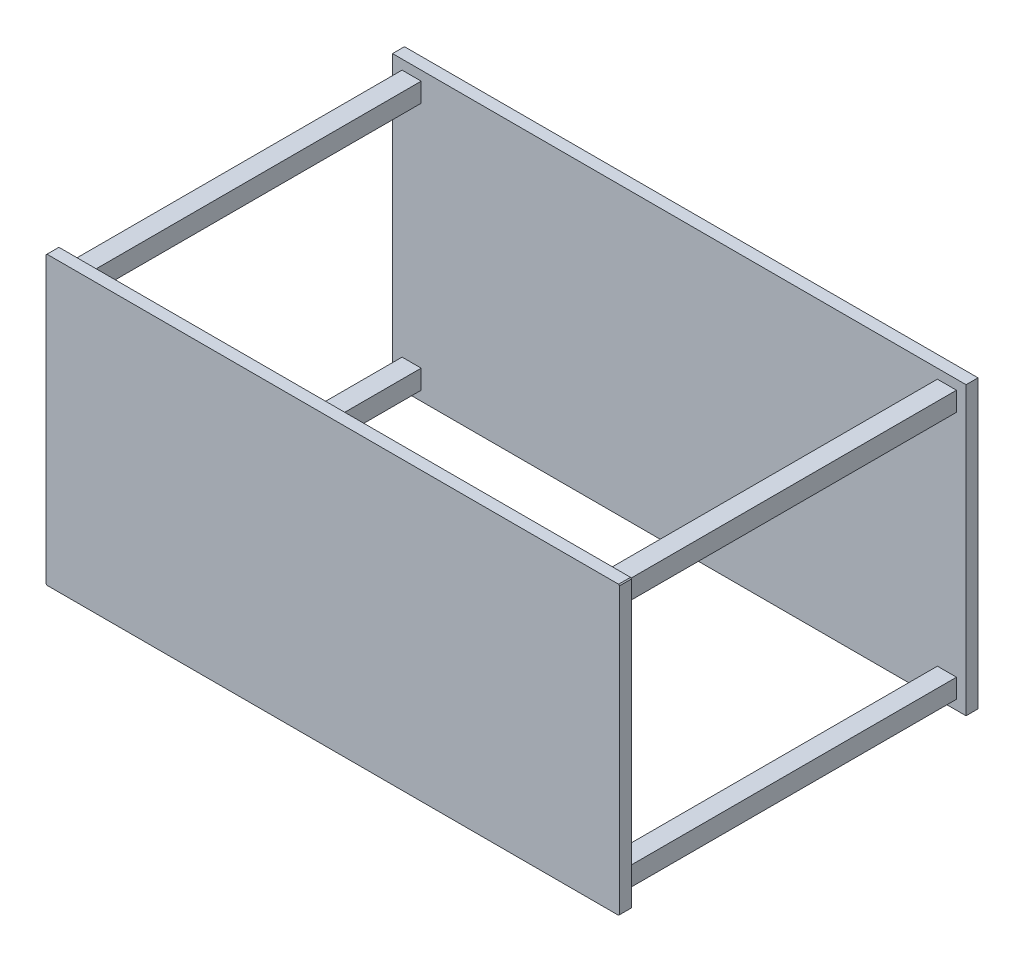
ISO-10303-21;
HEADER;
FILE_DESCRIPTION(('STEP AP214'),'2;1');
FILE_NAME('part.step','',(''),(''),'','','');
FILE_SCHEMA(('AUTOMOTIVE_DESIGN { 1 0 10303 214 1 1 1 1 }'));
ENDSEC;
DATA;
#1=APPLICATION_CONTEXT('core data for automotive mechanical design processes');
#2=APPLICATION_PROTOCOL_DEFINITION('international standard','automotive_design',2000,#1);
#3=PRODUCT_CONTEXT('',#1,'mechanical');
#4=PRODUCT('Part','Part','',(#3));
#5=PRODUCT_RELATED_PRODUCT_CATEGORY('part','',(#4));
#6=PRODUCT_DEFINITION_FORMATION('','',#4);
#7=PRODUCT_DEFINITION_CONTEXT('part definition',#1,'design');
#8=PRODUCT_DEFINITION('design','',#6,#7);
#9=PRODUCT_DEFINITION_SHAPE('','',#8);
#10=(LENGTH_UNIT() NAMED_UNIT(*) SI_UNIT(.MILLI.,.METRE.));
#11=(NAMED_UNIT(*) PLANE_ANGLE_UNIT() SI_UNIT($,.RADIAN.));
#12=(NAMED_UNIT(*) SI_UNIT($,.STERADIAN.) SOLID_ANGLE_UNIT());
#13=UNCERTAINTY_MEASURE_WITH_UNIT(LENGTH_MEASURE(1.E-05),#10,'distance_accuracy_value','');
#14=(GEOMETRIC_REPRESENTATION_CONTEXT(3) GLOBAL_UNCERTAINTY_ASSIGNED_CONTEXT((#13)) GLOBAL_UNIT_ASSIGNED_CONTEXT((#10,
#11,#12)) REPRESENTATION_CONTEXT('',''));
#15=CARTESIAN_POINT('',(0.,0.,0.));
#16=DIRECTION('',(0.,0.,1.));
#17=DIRECTION('',(1.,0.,0.));
#18=AXIS2_PLACEMENT_3D('',#15,#16,#17);
#19=CARTESIAN_POINT('',(0.,0.,25.));
#20=DIRECTION('',(0.,0.,-1.));
#21=DIRECTION('',(-1.,0.,0.));
#22=AXIS2_PLACEMENT_3D('',#19,#20,#21);
#23=PLANE('',#22);
#24=DIRECTION('',(0.,1.,0.));
#25=VECTOR('',#24,1.);
#26=CARTESIAN_POINT('',(580.,0.,25.));
#27=LINE('',#26,#25);
#28=CARTESIAN_POINT('',(580.,240.,25.));
#29=VERTEX_POINT('',#28);
#30=CARTESIAN_POINT('',(580.,280.,25.));
#31=VERTEX_POINT('',#30);
#32=EDGE_CURVE('E784',#29,#31,#27,.T.);
#33=ORIENTED_EDGE('',*,*,#32,.F.);
#34=DIRECTION('',(1.,0.,0.));
#35=VECTOR('',#34,1.);
#36=CARTESIAN_POINT('',(0.,240.,25.));
#37=LINE('',#36,#35);
#38=CARTESIAN_POINT('',(540.,240.,25.));
#39=VERTEX_POINT('',#38);
#40=EDGE_CURVE('E453',#39,#29,#37,.T.);
#41=ORIENTED_EDGE('',*,*,#40,.F.);
#42=DIRECTION('',(0.,-1.,0.));
#43=VECTOR('',#42,1.);
#44=CARTESIAN_POINT('',(540.,0.,25.));
#45=LINE('',#44,#43);
#46=CARTESIAN_POINT('',(540.,280.,25.));
#47=VERTEX_POINT('',#46);
#48=EDGE_CURVE('E768',#47,#39,#45,.T.);
#49=ORIENTED_EDGE('',*,*,#48,.F.);
#50=DIRECTION('',(-1.,0.,0.));
#51=VECTOR('',#50,1.);
#52=CARTESIAN_POINT('',(0.,280.,25.));
#53=LINE('',#52,#51);
#54=EDGE_CURVE('E772',#31,#47,#53,.T.);
#55=ORIENTED_EDGE('',*,*,#54,.F.);
#56=EDGE_LOOP('',(#33,#41,#49,#55));
#57=FACE_BOUND('',#56,.T.);
#58=DIRECTION('',(0.,1.,0.));
#59=VECTOR('',#58,1.);
#60=CARTESIAN_POINT('',(-540.,0.,25.));
#61=LINE('',#60,#59);
#62=CARTESIAN_POINT('',(-540.,-280.,25.));
#63=VERTEX_POINT('',#62);
#64=CARTESIAN_POINT('',(-540.,-240.,25.));
#65=VERTEX_POINT('',#64);
#66=EDGE_CURVE('E467',#63,#65,#61,.T.);
#67=ORIENTED_EDGE('',*,*,#66,.F.);
#68=DIRECTION('',(1.,0.,0.));
#69=VECTOR('',#68,1.);
#70=CARTESIAN_POINT('',(0.,-280.,25.));
#71=LINE('',#70,#69);
#72=CARTESIAN_POINT('',(-580.,-280.,25.));
#73=VERTEX_POINT('',#72);
#74=EDGE_CURVE('E488',#73,#63,#71,.T.);
#75=ORIENTED_EDGE('',*,*,#74,.F.);
#76=DIRECTION('',(0.,-1.,0.));
#77=VECTOR('',#76,1.);
#78=CARTESIAN_POINT('',(-580.,0.,25.));
#79=LINE('',#78,#77);
#80=CARTESIAN_POINT('',(-580.,-240.,25.));
#81=VERTEX_POINT('',#80);
#82=EDGE_CURVE('E477',#81,#73,#79,.T.);
#83=ORIENTED_EDGE('',*,*,#82,.F.);
#84=DIRECTION('',(-1.,0.,0.));
#85=VECTOR('',#84,1.);
#86=CARTESIAN_POINT('',(0.,-240.,25.));
#87=LINE('',#86,#85);
#88=EDGE_CURVE('E474',#65,#81,#87,.T.);
#89=ORIENTED_EDGE('',*,*,#88,.F.);
#90=EDGE_LOOP('',(#67,#75,#83,#89));
#91=FACE_BOUND('',#90,.T.);
#92=DIRECTION('',(0.,1.,0.));
#93=VECTOR('',#92,1.);
#94=CARTESIAN_POINT('',(600.,-300.,25.));
#95=LINE('',#94,#93);
#96=CARTESIAN_POINT('',(600.,-300.,25.));
#97=VERTEX_POINT('',#96);
#98=CARTESIAN_POINT('',(600.,300.,25.));
#99=VERTEX_POINT('',#98);
#100=EDGE_CURVE('E719',#97,#99,#95,.T.);
#101=ORIENTED_EDGE('',*,*,#100,.T.);
#102=DIRECTION('',(-1.,0.,0.));
#103=VECTOR('',#102,1.);
#104=CARTESIAN_POINT('',(-600.,300.,25.));
#105=LINE('',#104,#103);
#106=CARTESIAN_POINT('',(-600.,300.,25.));
#107=VERTEX_POINT('',#106);
#108=EDGE_CURVE('E724',#99,#107,#105,.T.);
#109=ORIENTED_EDGE('',*,*,#108,.T.);
#110=DIRECTION('',(0.,-1.,0.));
#111=VECTOR('',#110,1.);
#112=CARTESIAN_POINT('',(-600.,-300.,25.));
#113=LINE('',#112,#111);
#114=CARTESIAN_POINT('',(-600.,-300.,25.));
#115=VERTEX_POINT('',#114);
#116=EDGE_CURVE('E692',#107,#115,#113,.T.);
#117=ORIENTED_EDGE('',*,*,#116,.T.);
#118=DIRECTION('',(1.,0.,0.));
#119=VECTOR('',#118,1.);
#120=CARTESIAN_POINT('',(-600.,-300.,25.));
#121=LINE('',#120,#119);
#122=EDGE_CURVE('E686',#115,#97,#121,.T.);
#123=ORIENTED_EDGE('',*,*,#122,.T.);
#124=EDGE_LOOP('',(#101,#109,#117,#123));
#125=FACE_BOUND('',#124,.T.);
#126=DIRECTION('',(0.,1.,0.));
#127=VECTOR('',#126,1.);
#128=CARTESIAN_POINT('',(580.,0.,25.));
#129=LINE('',#128,#127);
#130=CARTESIAN_POINT('',(580.,-280.,25.));
#131=VERTEX_POINT('',#130);
#132=CARTESIAN_POINT('',(580.,-240.,25.));
#133=VERTEX_POINT('',#132);
#134=EDGE_CURVE('E449',#131,#133,#129,.T.);
#135=ORIENTED_EDGE('',*,*,#134,.F.);
#136=DIRECTION('',(1.,0.,0.));
#137=VECTOR('',#136,1.);
#138=CARTESIAN_POINT('',(0.,-280.,25.));
#139=LINE('',#138,#137);
#140=CARTESIAN_POINT('',(540.,-280.,25.));
#141=VERTEX_POINT('',#140);
#142=EDGE_CURVE('E451',#141,#131,#139,.T.);
#143=ORIENTED_EDGE('',*,*,#142,.F.);
#144=DIRECTION('',(0.,-1.,0.));
#145=VECTOR('',#144,1.);
#146=CARTESIAN_POINT('',(540.,0.,25.));
#147=LINE('',#146,#145);
#148=CARTESIAN_POINT('',(540.,-240.,25.));
#149=VERTEX_POINT('',#148);
#150=EDGE_CURVE('E437',#149,#141,#147,.T.);
#151=ORIENTED_EDGE('',*,*,#150,.F.);
#152=DIRECTION('',(-1.,0.,0.));
#153=VECTOR('',#152,1.);
#154=CARTESIAN_POINT('',(0.,-240.,25.));
#155=LINE('',#154,#153);
#156=EDGE_CURVE('E444',#133,#149,#155,.T.);
#157=ORIENTED_EDGE('',*,*,#156,.F.);
#158=EDGE_LOOP('',(#135,#143,#151,#157));
#159=FACE_BOUND('',#158,.T.);
#160=DIRECTION('',(0.,1.,0.));
#161=VECTOR('',#160,1.);
#162=CARTESIAN_POINT('',(-540.,0.,25.));
#163=LINE('',#162,#161);
#164=CARTESIAN_POINT('',(-540.,240.,25.));
#165=VERTEX_POINT('',#164);
#166=CARTESIAN_POINT('',(-540.,280.,25.));
#167=VERTEX_POINT('',#166);
#168=EDGE_CURVE('E701',#165,#167,#163,.T.);
#169=ORIENTED_EDGE('',*,*,#168,.F.);
#170=DIRECTION('',(1.,0.,0.));
#171=VECTOR('',#170,1.);
#172=CARTESIAN_POINT('',(0.,240.,25.));
#173=LINE('',#172,#171);
#174=CARTESIAN_POINT('',(-580.,240.,25.));
#175=VERTEX_POINT('',#174);
#176=EDGE_CURVE('E257',#175,#165,#173,.T.);
#177=ORIENTED_EDGE('',*,*,#176,.F.);
#178=DIRECTION('',(0.,-1.,0.));
#179=VECTOR('',#178,1.);
#180=CARTESIAN_POINT('',(-580.,0.,25.));
#181=LINE('',#180,#179);
#182=CARTESIAN_POINT('',(-580.,280.,25.));
#183=VERTEX_POINT('',#182);
#184=EDGE_CURVE('E788',#183,#175,#181,.T.);
#185=ORIENTED_EDGE('',*,*,#184,.F.);
#186=DIRECTION('',(-1.,0.,0.));
#187=VECTOR('',#186,1.);
#188=CARTESIAN_POINT('',(0.,280.,25.));
#189=LINE('',#188,#187);
#190=EDGE_CURVE('E714',#167,#183,#189,.T.);
#191=ORIENTED_EDGE('',*,*,#190,.F.);
#192=EDGE_LOOP('',(#169,#177,#185,#191));
#193=FACE_BOUND('',#192,.T.);
#194=ADVANCED_FACE('F49',(#57,#91,#125,#159,#193),#23,.F.);
#195=CARTESIAN_POINT('',(600.,-300.,25.));
#196=DIRECTION('',(-1.,0.,0.));
#197=DIRECTION('',(0.,0.,1.));
#198=AXIS2_PLACEMENT_3D('',#195,#196,#197);
#199=PLANE('',#198);
#200=DIRECTION('',(0.,1.,0.));
#201=VECTOR('',#200,1.);
#202=CARTESIAN_POINT('',(600.,-300.,0.));
#203=LINE('',#202,#201);
#204=CARTESIAN_POINT('',(600.,-300.,0.));
#205=VERTEX_POINT('',#204);
#206=CARTESIAN_POINT('',(600.,300.,0.));
#207=VERTEX_POINT('',#206);
#208=EDGE_CURVE('E694',#205,#207,#203,.T.);
#209=ORIENTED_EDGE('',*,*,#208,.T.);
#210=DIRECTION('',(0.,0.,-1.));
#211=VECTOR('',#210,1.);
#212=CARTESIAN_POINT('',(600.,300.,25.));
#213=LINE('',#212,#211);
#214=EDGE_CURVE('E663',#99,#207,#213,.T.);
#215=ORIENTED_EDGE('',*,*,#214,.F.);
#216=ORIENTED_EDGE('',*,*,#100,.F.);
#217=DIRECTION('',(0.,0.,-1.));
#218=VECTOR('',#217,1.);
#219=CARTESIAN_POINT('',(600.,-300.,25.));
#220=LINE('',#219,#218);
#221=EDGE_CURVE('E679',#97,#205,#220,.T.);
#222=ORIENTED_EDGE('',*,*,#221,.T.);
#223=EDGE_LOOP('',(#209,#215,#216,#222));
#224=FACE_BOUND('',#223,.T.);
#225=ADVANCED_FACE('F554',(#224),#199,.F.);
#226=CARTESIAN_POINT('',(-600.,300.,25.));
#227=DIRECTION('',(0.,-1.,0.));
#228=DIRECTION('',(0.,0.,-1.));
#229=AXIS2_PLACEMENT_3D('',#226,#227,#228);
#230=PLANE('',#229);
#231=DIRECTION('',(-1.,0.,0.));
#232=VECTOR('',#231,1.);
#233=CARTESIAN_POINT('',(-600.,300.,0.));
#234=LINE('',#233,#232);
#235=CARTESIAN_POINT('',(-600.,300.,0.));
#236=VERTEX_POINT('',#235);
#237=EDGE_CURVE('E697',#207,#236,#234,.T.);
#238=ORIENTED_EDGE('',*,*,#237,.T.);
#239=DIRECTION('',(0.,0.,-1.));
#240=VECTOR('',#239,1.);
#241=CARTESIAN_POINT('',(-600.,300.,25.));
#242=LINE('',#241,#240);
#243=EDGE_CURVE('E670',#107,#236,#242,.T.);
#244=ORIENTED_EDGE('',*,*,#243,.F.);
#245=ORIENTED_EDGE('',*,*,#108,.F.);
#246=ORIENTED_EDGE('',*,*,#214,.T.);
#247=EDGE_LOOP('',(#238,#244,#245,#246));
#248=FACE_BOUND('',#247,.T.);
#249=ADVANCED_FACE('F563',(#248),#230,.F.);
#250=CARTESIAN_POINT('',(-600.,-300.,25.));
#251=DIRECTION('',(1.,0.,0.));
#252=DIRECTION('',(0.,0.,-1.));
#253=AXIS2_PLACEMENT_3D('',#250,#251,#252);
#254=PLANE('',#253);
#255=DIRECTION('',(0.,-1.,0.));
#256=VECTOR('',#255,1.);
#257=CARTESIAN_POINT('',(-600.,-300.,0.));
#258=LINE('',#257,#256);
#259=CARTESIAN_POINT('',(-600.,-300.,0.));
#260=VERTEX_POINT('',#259);
#261=EDGE_CURVE('E729',#236,#260,#258,.T.);
#262=ORIENTED_EDGE('',*,*,#261,.T.);
#263=DIRECTION('',(0.,0.,-1.));
#264=VECTOR('',#263,1.);
#265=CARTESIAN_POINT('',(-600.,-300.,25.));
#266=LINE('',#265,#264);
#267=EDGE_CURVE('E674',#115,#260,#266,.T.);
#268=ORIENTED_EDGE('',*,*,#267,.F.);
#269=ORIENTED_EDGE('',*,*,#116,.F.);
#270=ORIENTED_EDGE('',*,*,#243,.T.);
#271=EDGE_LOOP('',(#262,#268,#269,#270));
#272=FACE_BOUND('',#271,.T.);
#273=ADVANCED_FACE('F573',(#272),#254,.F.);
#274=CARTESIAN_POINT('',(-600.,-300.,25.));
#275=DIRECTION('',(0.,1.,0.));
#276=DIRECTION('',(0.,0.,1.));
#277=AXIS2_PLACEMENT_3D('',#274,#275,#276);
#278=PLANE('',#277);
#279=DIRECTION('',(1.,0.,0.));
#280=VECTOR('',#279,1.);
#281=CARTESIAN_POINT('',(-600.,-300.,0.));
#282=LINE('',#281,#280);
#283=EDGE_CURVE('E722',#260,#205,#282,.T.);
#284=ORIENTED_EDGE('',*,*,#283,.T.);
#285=ORIENTED_EDGE('',*,*,#221,.F.);
#286=ORIENTED_EDGE('',*,*,#122,.F.);
#287=ORIENTED_EDGE('',*,*,#267,.T.);
#288=EDGE_LOOP('',(#284,#285,#286,#287));
#289=FACE_BOUND('',#288,.T.);
#290=ADVANCED_FACE('F566',(#289),#278,.F.);
#291=CARTESIAN_POINT('',(0.,0.,0.));
#292=DIRECTION('',(0.,0.,-1.));
#293=DIRECTION('',(-1.,0.,0.));
#294=AXIS2_PLACEMENT_3D('',#291,#292,#293);
#295=PLANE('',#294);
#296=ORIENTED_EDGE('',*,*,#208,.F.);
#297=ORIENTED_EDGE('',*,*,#283,.F.);
#298=ORIENTED_EDGE('',*,*,#261,.F.);
#299=ORIENTED_EDGE('',*,*,#237,.F.);
#300=EDGE_LOOP('',(#296,#297,#298,#299));
#301=FACE_BOUND('',#300,.T.);
#302=ADVANCED_FACE('F567',(#301),#295,.T.);
#303=CARTESIAN_POINT('',(-540.,-280.,725.));
#304=DIRECTION('',(-1.,0.,0.));
#305=DIRECTION('',(0.,0.,1.));
#306=AXIS2_PLACEMENT_3D('',#303,#304,#305);
#307=PLANE('',#306);
#308=DIRECTION('',(0.,0.,-1.));
#309=VECTOR('',#308,1.);
#310=CARTESIAN_POINT('',(-540.,-280.,725.));
#311=LINE('',#310,#309);
#312=CARTESIAN_POINT('',(-540.,-280.,725.));
#313=VERTEX_POINT('',#312);
#314=EDGE_CURVE('E509',#313,#63,#311,.T.);
#315=ORIENTED_EDGE('',*,*,#314,.T.);
#316=ORIENTED_EDGE('',*,*,#66,.T.);
#317=DIRECTION('',(0.,0.,-1.));
#318=VECTOR('',#317,1.);
#319=CARTESIAN_POINT('',(-540.,-240.,725.));
#320=LINE('',#319,#318);
#321=CARTESIAN_POINT('',(-540.,-240.,725.));
#322=VERTEX_POINT('',#321);
#323=EDGE_CURVE('E495',#322,#65,#320,.T.);
#324=ORIENTED_EDGE('',*,*,#323,.F.);
#325=DIRECTION('',(0.,1.,0.));
#326=VECTOR('',#325,1.);
#327=CARTESIAN_POINT('',(-540.,-280.,725.));
#328=LINE('',#327,#326);
#329=EDGE_CURVE('E388',#313,#322,#328,.T.);
#330=ORIENTED_EDGE('',*,*,#329,.F.);
#331=EDGE_LOOP('',(#315,#316,#324,#330));
#332=FACE_BOUND('',#331,.T.);
#333=ADVANCED_FACE('F529',(#332),#307,.F.);
#334=CARTESIAN_POINT('',(-580.,-240.,725.));
#335=DIRECTION('',(0.,-1.,0.));
#336=DIRECTION('',(0.,0.,-1.));
#337=AXIS2_PLACEMENT_3D('',#334,#335,#336);
#338=PLANE('',#337);
#339=ORIENTED_EDGE('',*,*,#323,.T.);
#340=ORIENTED_EDGE('',*,*,#88,.T.);
#341=DIRECTION('',(0.,0.,-1.));
#342=VECTOR('',#341,1.);
#343=CARTESIAN_POINT('',(-580.,-240.,725.));
#344=LINE('',#343,#342);
#345=CARTESIAN_POINT('',(-580.,-240.,725.));
#346=VERTEX_POINT('',#345);
#347=EDGE_CURVE('E500',#346,#81,#344,.T.);
#348=ORIENTED_EDGE('',*,*,#347,.F.);
#349=DIRECTION('',(-1.,0.,0.));
#350=VECTOR('',#349,1.);
#351=CARTESIAN_POINT('',(-580.,-240.,725.));
#352=LINE('',#351,#350);
#353=EDGE_CURVE('E391',#322,#346,#352,.T.);
#354=ORIENTED_EDGE('',*,*,#353,.F.);
#355=EDGE_LOOP('',(#339,#340,#348,#354));
#356=FACE_BOUND('',#355,.T.);
#357=ADVANCED_FACE('F526',(#356),#338,.F.);
#358=CARTESIAN_POINT('',(-580.,-280.,725.));
#359=DIRECTION('',(1.,0.,0.));
#360=DIRECTION('',(0.,0.,-1.));
#361=AXIS2_PLACEMENT_3D('',#358,#359,#360);
#362=PLANE('',#361);
#363=ORIENTED_EDGE('',*,*,#347,.T.);
#364=ORIENTED_EDGE('',*,*,#82,.T.);
#365=DIRECTION('',(0.,0.,-1.));
#366=VECTOR('',#365,1.);
#367=CARTESIAN_POINT('',(-580.,-280.,725.));
#368=LINE('',#367,#366);
#369=CARTESIAN_POINT('',(-580.,-280.,725.));
#370=VERTEX_POINT('',#369);
#371=EDGE_CURVE('E504',#370,#73,#368,.T.);
#372=ORIENTED_EDGE('',*,*,#371,.F.);
#373=DIRECTION('',(0.,-1.,0.));
#374=VECTOR('',#373,1.);
#375=CARTESIAN_POINT('',(-580.,-280.,725.));
#376=LINE('',#375,#374);
#377=EDGE_CURVE('E519',#346,#370,#376,.T.);
#378=ORIENTED_EDGE('',*,*,#377,.F.);
#379=EDGE_LOOP('',(#363,#364,#372,#378));
#380=FACE_BOUND('',#379,.T.);
#381=ADVANCED_FACE('F545',(#380),#362,.F.);
#382=CARTESIAN_POINT('',(-580.,-280.,725.));
#383=DIRECTION('',(0.,1.,0.));
#384=DIRECTION('',(0.,0.,1.));
#385=AXIS2_PLACEMENT_3D('',#382,#383,#384);
#386=PLANE('',#385);
#387=ORIENTED_EDGE('',*,*,#371,.T.);
#388=ORIENTED_EDGE('',*,*,#74,.T.);
#389=ORIENTED_EDGE('',*,*,#314,.F.);
#390=DIRECTION('',(1.,0.,0.));
#391=VECTOR('',#390,1.);
#392=CARTESIAN_POINT('',(-580.,-280.,725.));
#393=LINE('',#392,#391);
#394=EDGE_CURVE('E511',#370,#313,#393,.T.);
#395=ORIENTED_EDGE('',*,*,#394,.F.);
#396=EDGE_LOOP('',(#387,#388,#389,#395));
#397=FACE_BOUND('',#396,.T.);
#398=ADVANCED_FACE('F540',(#397),#386,.F.);
#399=CARTESIAN_POINT('',(580.,-280.,725.));
#400=DIRECTION('',(-1.,0.,0.));
#401=DIRECTION('',(0.,0.,1.));
#402=AXIS2_PLACEMENT_3D('',#399,#400,#401);
#403=PLANE('',#402);
#404=DIRECTION('',(0.,0.,-1.));
#405=VECTOR('',#404,1.);
#406=CARTESIAN_POINT('',(580.,-280.,725.));
#407=LINE('',#406,#405);
#408=CARTESIAN_POINT('',(580.,-280.,725.));
#409=VERTEX_POINT('',#408);
#410=EDGE_CURVE('E419',#409,#131,#407,.T.);
#411=ORIENTED_EDGE('',*,*,#410,.T.);
#412=ORIENTED_EDGE('',*,*,#134,.T.);
#413=DIRECTION('',(0.,0.,-1.));
#414=VECTOR('',#413,1.);
#415=CARTESIAN_POINT('',(580.,-240.,725.));
#416=LINE('',#415,#414);
#417=CARTESIAN_POINT('',(580.,-240.,725.));
#418=VERTEX_POINT('',#417);
#419=EDGE_CURVE('E335',#418,#133,#416,.T.);
#420=ORIENTED_EDGE('',*,*,#419,.F.);
#421=DIRECTION('',(0.,1.,0.));
#422=VECTOR('',#421,1.);
#423=CARTESIAN_POINT('',(580.,-280.,725.));
#424=LINE('',#423,#422);
#425=EDGE_CURVE('E382',#409,#418,#424,.T.);
#426=ORIENTED_EDGE('',*,*,#425,.F.);
#427=EDGE_LOOP('',(#411,#412,#420,#426));
#428=FACE_BOUND('',#427,.T.);
#429=ADVANCED_FACE('F548',(#428),#403,.F.);
#430=CARTESIAN_POINT('',(540.,-240.,725.));
#431=DIRECTION('',(0.,-1.,0.));
#432=DIRECTION('',(0.,0.,-1.));
#433=AXIS2_PLACEMENT_3D('',#430,#431,#432);
#434=PLANE('',#433);
#435=ORIENTED_EDGE('',*,*,#419,.T.);
#436=ORIENTED_EDGE('',*,*,#156,.T.);
#437=DIRECTION('',(0.,0.,-1.));
#438=VECTOR('',#437,1.);
#439=CARTESIAN_POINT('',(540.,-240.,725.));
#440=LINE('',#439,#438);
#441=CARTESIAN_POINT('',(540.,-240.,725.));
#442=VERTEX_POINT('',#441);
#443=EDGE_CURVE('E339',#442,#149,#440,.T.);
#444=ORIENTED_EDGE('',*,*,#443,.F.);
#445=DIRECTION('',(-1.,0.,0.));
#446=VECTOR('',#445,1.);
#447=CARTESIAN_POINT('',(540.,-240.,725.));
#448=LINE('',#447,#446);
#449=EDGE_CURVE('E408',#418,#442,#448,.T.);
#450=ORIENTED_EDGE('',*,*,#449,.F.);
#451=EDGE_LOOP('',(#435,#436,#444,#450));
#452=FACE_BOUND('',#451,.T.);
#453=ADVANCED_FACE('F442',(#452),#434,.F.);
#454=CARTESIAN_POINT('',(540.,-280.,725.));
#455=DIRECTION('',(1.,0.,0.));
#456=DIRECTION('',(0.,0.,-1.));
#457=AXIS2_PLACEMENT_3D('',#454,#455,#456);
#458=PLANE('',#457);
#459=ORIENTED_EDGE('',*,*,#443,.T.);
#460=ORIENTED_EDGE('',*,*,#150,.T.);
#461=DIRECTION('',(0.,0.,-1.));
#462=VECTOR('',#461,1.);
#463=CARTESIAN_POINT('',(540.,-280.,725.));
#464=LINE('',#463,#462);
#465=CARTESIAN_POINT('',(540.,-280.,725.));
#466=VERTEX_POINT('',#465);
#467=EDGE_CURVE('E421',#466,#141,#464,.T.);
#468=ORIENTED_EDGE('',*,*,#467,.F.);
#469=DIRECTION('',(0.,-1.,0.));
#470=VECTOR('',#469,1.);
#471=CARTESIAN_POINT('',(540.,-280.,725.));
#472=LINE('',#471,#470);
#473=EDGE_CURVE('E406',#442,#466,#472,.T.);
#474=ORIENTED_EDGE('',*,*,#473,.F.);
#475=EDGE_LOOP('',(#459,#460,#468,#474));
#476=FACE_BOUND('',#475,.T.);
#477=ADVANCED_FACE('F440',(#476),#458,.F.);
#478=CARTESIAN_POINT('',(540.,-280.,725.));
#479=DIRECTION('',(0.,1.,0.));
#480=DIRECTION('',(0.,0.,1.));
#481=AXIS2_PLACEMENT_3D('',#478,#479,#480);
#482=PLANE('',#481);
#483=ORIENTED_EDGE('',*,*,#467,.T.);
#484=ORIENTED_EDGE('',*,*,#142,.T.);
#485=ORIENTED_EDGE('',*,*,#410,.F.);
#486=DIRECTION('',(1.,0.,0.));
#487=VECTOR('',#486,1.);
#488=CARTESIAN_POINT('',(540.,-280.,725.));
#489=LINE('',#488,#487);
#490=EDGE_CURVE('E412',#466,#409,#489,.T.);
#491=ORIENTED_EDGE('',*,*,#490,.F.);
#492=EDGE_LOOP('',(#483,#484,#485,#491));
#493=FACE_BOUND('',#492,.T.);
#494=ADVANCED_FACE('F819',(#493),#482,.F.);
#495=CARTESIAN_POINT('',(580.,240.,725.));
#496=DIRECTION('',(-1.,0.,0.));
#497=DIRECTION('',(0.,0.,1.));
#498=AXIS2_PLACEMENT_3D('',#495,#496,#497);
#499=PLANE('',#498);
#500=DIRECTION('',(0.,0.,-1.));
#501=VECTOR('',#500,1.);
#502=CARTESIAN_POINT('',(580.,240.,725.));
#503=LINE('',#502,#501);
#504=CARTESIAN_POINT('',(580.,240.,725.));
#505=VERTEX_POINT('',#504);
#506=EDGE_CURVE('E362',#505,#29,#503,.T.);
#507=ORIENTED_EDGE('',*,*,#506,.T.);
#508=ORIENTED_EDGE('',*,*,#32,.T.);
#509=DIRECTION('',(0.,0.,-1.));
#510=VECTOR('',#509,1.);
#511=CARTESIAN_POINT('',(580.,280.,725.));
#512=LINE('',#511,#510);
#513=CARTESIAN_POINT('',(580.,280.,725.));
#514=VERTEX_POINT('',#513);
#515=EDGE_CURVE('E247',#514,#31,#512,.T.);
#516=ORIENTED_EDGE('',*,*,#515,.F.);
#517=DIRECTION('',(0.,1.,0.));
#518=VECTOR('',#517,1.);
#519=CARTESIAN_POINT('',(580.,240.,725.));
#520=LINE('',#519,#518);
#521=EDGE_CURVE('E298',#505,#514,#520,.T.);
#522=ORIENTED_EDGE('',*,*,#521,.F.);
#523=EDGE_LOOP('',(#507,#508,#516,#522));
#524=FACE_BOUND('',#523,.T.);
#525=ADVANCED_FACE('F765',(#524),#499,.F.);
#526=CARTESIAN_POINT('',(540.,280.,725.));
#527=DIRECTION('',(0.,-1.,0.));
#528=DIRECTION('',(0.,0.,-1.));
#529=AXIS2_PLACEMENT_3D('',#526,#527,#528);
#530=PLANE('',#529);
#531=ORIENTED_EDGE('',*,*,#515,.T.);
#532=ORIENTED_EDGE('',*,*,#54,.T.);
#533=DIRECTION('',(0.,0.,-1.));
#534=VECTOR('',#533,1.);
#535=CARTESIAN_POINT('',(540.,280.,725.));
#536=LINE('',#535,#534);
#537=CARTESIAN_POINT('',(540.,280.,725.));
#538=VERTEX_POINT('',#537);
#539=EDGE_CURVE('E372',#538,#47,#536,.T.);
#540=ORIENTED_EDGE('',*,*,#539,.F.);
#541=DIRECTION('',(-1.,0.,0.));
#542=VECTOR('',#541,1.);
#543=CARTESIAN_POINT('',(540.,280.,725.));
#544=LINE('',#543,#542);
#545=EDGE_CURVE('E346',#514,#538,#544,.T.);
#546=ORIENTED_EDGE('',*,*,#545,.F.);
#547=EDGE_LOOP('',(#531,#532,#540,#546));
#548=FACE_BOUND('',#547,.T.);
#549=ADVANCED_FACE('F813',(#548),#530,.F.);
#550=CARTESIAN_POINT('',(540.,240.,725.));
#551=DIRECTION('',(1.,0.,0.));
#552=DIRECTION('',(0.,0.,-1.));
#553=AXIS2_PLACEMENT_3D('',#550,#551,#552);
#554=PLANE('',#553);
#555=ORIENTED_EDGE('',*,*,#539,.T.);
#556=ORIENTED_EDGE('',*,*,#48,.T.);
#557=DIRECTION('',(0.,0.,-1.));
#558=VECTOR('',#557,1.);
#559=CARTESIAN_POINT('',(540.,240.,725.));
#560=LINE('',#559,#558);
#561=CARTESIAN_POINT('',(540.,240.,725.));
#562=VERTEX_POINT('',#561);
#563=EDGE_CURVE('E367',#562,#39,#560,.T.);
#564=ORIENTED_EDGE('',*,*,#563,.F.);
#565=DIRECTION('',(0.,-1.,0.));
#566=VECTOR('',#565,1.);
#567=CARTESIAN_POINT('',(540.,240.,725.));
#568=LINE('',#567,#566);
#569=EDGE_CURVE('E354',#538,#562,#568,.T.);
#570=ORIENTED_EDGE('',*,*,#569,.F.);
#571=EDGE_LOOP('',(#555,#556,#564,#570));
#572=FACE_BOUND('',#571,.T.);
#573=ADVANCED_FACE('F807',(#572),#554,.F.);
#574=CARTESIAN_POINT('',(540.,240.,725.));
#575=DIRECTION('',(0.,1.,0.));
#576=DIRECTION('',(0.,0.,1.));
#577=AXIS2_PLACEMENT_3D('',#574,#575,#576);
#578=PLANE('',#577);
#579=ORIENTED_EDGE('',*,*,#563,.T.);
#580=ORIENTED_EDGE('',*,*,#40,.T.);
#581=ORIENTED_EDGE('',*,*,#506,.F.);
#582=DIRECTION('',(1.,0.,0.));
#583=VECTOR('',#582,1.);
#584=CARTESIAN_POINT('',(540.,240.,725.));
#585=LINE('',#584,#583);
#586=EDGE_CURVE('E360',#562,#505,#585,.T.);
#587=ORIENTED_EDGE('',*,*,#586,.F.);
#588=EDGE_LOOP('',(#579,#580,#581,#587));
#589=FACE_BOUND('',#588,.T.);
#590=ADVANCED_FACE('F766',(#589),#578,.F.);
#591=CARTESIAN_POINT('',(-540.,240.,725.));
#592=DIRECTION('',(-1.,0.,0.));
#593=DIRECTION('',(0.,0.,1.));
#594=AXIS2_PLACEMENT_3D('',#591,#592,#593);
#595=PLANE('',#594);
#596=DIRECTION('',(0.,0.,-1.));
#597=VECTOR('',#596,1.);
#598=CARTESIAN_POINT('',(-540.,240.,725.));
#599=LINE('',#598,#597);
#600=CARTESIAN_POINT('',(-540.,240.,725.));
#601=VERTEX_POINT('',#600);
#602=EDGE_CURVE('E242',#601,#165,#599,.T.);
#603=ORIENTED_EDGE('',*,*,#602,.T.);
#604=ORIENTED_EDGE('',*,*,#168,.T.);
#605=DIRECTION('',(0.,0.,-1.));
#606=VECTOR('',#605,1.);
#607=CARTESIAN_POINT('',(-540.,280.,725.));
#608=LINE('',#607,#606);
#609=CARTESIAN_POINT('',(-540.,280.,725.));
#610=VERTEX_POINT('',#609);
#611=EDGE_CURVE('E241',#610,#167,#608,.T.);
#612=ORIENTED_EDGE('',*,*,#611,.F.);
#613=DIRECTION('',(0.,1.,0.));
#614=VECTOR('',#613,1.);
#615=CARTESIAN_POINT('',(-540.,240.,725.));
#616=LINE('',#615,#614);
#617=EDGE_CURVE('E239',#601,#610,#616,.T.);
#618=ORIENTED_EDGE('',*,*,#617,.F.);
#619=EDGE_LOOP('',(#603,#604,#612,#618));
#620=FACE_BOUND('',#619,.T.);
#621=ADVANCED_FACE('F243',(#620),#595,.F.);
#622=CARTESIAN_POINT('',(-580.,280.,725.));
#623=DIRECTION('',(0.,-1.,0.));
#624=DIRECTION('',(0.,0.,-1.));
#625=AXIS2_PLACEMENT_3D('',#622,#623,#624);
#626=PLANE('',#625);
#627=ORIENTED_EDGE('',*,*,#611,.T.);
#628=ORIENTED_EDGE('',*,*,#190,.T.);
#629=DIRECTION('',(0.,0.,-1.));
#630=VECTOR('',#629,1.);
#631=CARTESIAN_POINT('',(-580.,280.,725.));
#632=LINE('',#631,#630);
#633=CARTESIAN_POINT('',(-580.,280.,725.));
#634=VERTEX_POINT('',#633);
#635=EDGE_CURVE('E290',#634,#183,#632,.T.);
#636=ORIENTED_EDGE('',*,*,#635,.F.);
#637=DIRECTION('',(-1.,0.,0.));
#638=VECTOR('',#637,1.);
#639=CARTESIAN_POINT('',(-580.,280.,725.));
#640=LINE('',#639,#638);
#641=EDGE_CURVE('E253',#610,#634,#640,.T.);
#642=ORIENTED_EDGE('',*,*,#641,.F.);
#643=EDGE_LOOP('',(#627,#628,#636,#642));
#644=FACE_BOUND('',#643,.T.);
#645=ADVANCED_FACE('F753',(#644),#626,.F.);
#646=CARTESIAN_POINT('',(-580.,240.,725.));
#647=DIRECTION('',(1.,0.,0.));
#648=DIRECTION('',(0.,0.,-1.));
#649=AXIS2_PLACEMENT_3D('',#646,#647,#648);
#650=PLANE('',#649);
#651=ORIENTED_EDGE('',*,*,#635,.T.);
#652=ORIENTED_EDGE('',*,*,#184,.T.);
#653=DIRECTION('',(0.,0.,-1.));
#654=VECTOR('',#653,1.);
#655=CARTESIAN_POINT('',(-580.,240.,725.));
#656=LINE('',#655,#654);
#657=CARTESIAN_POINT('',(-580.,240.,725.));
#658=VERTEX_POINT('',#657);
#659=EDGE_CURVE('E265',#658,#175,#656,.T.);
#660=ORIENTED_EDGE('',*,*,#659,.F.);
#661=DIRECTION('',(0.,-1.,0.));
#662=VECTOR('',#661,1.);
#663=CARTESIAN_POINT('',(-580.,240.,725.));
#664=LINE('',#663,#662);
#665=EDGE_CURVE('E270',#634,#658,#664,.T.);
#666=ORIENTED_EDGE('',*,*,#665,.F.);
#667=EDGE_LOOP('',(#651,#652,#660,#666));
#668=FACE_BOUND('',#667,.T.);
#669=ADVANCED_FACE('F791',(#668),#650,.F.);
#670=CARTESIAN_POINT('',(-580.,240.,725.));
#671=DIRECTION('',(0.,1.,0.));
#672=DIRECTION('',(0.,0.,1.));
#673=AXIS2_PLACEMENT_3D('',#670,#671,#672);
#674=PLANE('',#673);
#675=ORIENTED_EDGE('',*,*,#659,.T.);
#676=ORIENTED_EDGE('',*,*,#176,.T.);
#677=ORIENTED_EDGE('',*,*,#602,.F.);
#678=DIRECTION('',(1.,0.,0.));
#679=VECTOR('',#678,1.);
#680=CARTESIAN_POINT('',(-580.,240.,725.));
#681=LINE('',#680,#679);
#682=EDGE_CURVE('E256',#658,#601,#681,.T.);
#683=ORIENTED_EDGE('',*,*,#682,.F.);
#684=EDGE_LOOP('',(#675,#676,#677,#683));
#685=FACE_BOUND('',#684,.T.);
#686=ADVANCED_FACE('F260',(#685),#674,.F.);
#687=CARTESIAN_POINT('',(600.,-300.,750.));
#688=DIRECTION('',(-1.,0.,0.));
#689=DIRECTION('',(0.,0.,1.));
#690=AXIS2_PLACEMENT_3D('',#687,#688,#689);
#691=PLANE('',#690);
#692=DIRECTION('',(0.,1.,0.));
#693=VECTOR('',#692,1.);
#694=CARTESIAN_POINT('',(600.,-300.,750.));
#695=LINE('',#694,#693);
#696=CARTESIAN_POINT('',(600.,-298.,750.));
#697=VERTEX_POINT('',#696);
#698=CARTESIAN_POINT('',(600.,298.,750.));
#699=VERTEX_POINT('',#698);
#700=EDGE_CURVE('E332',#697,#699,#695,.T.);
#701=ORIENTED_EDGE('',*,*,#700,.F.);
#702=DIRECTION('',(0.,0.,-1.));
#703=VECTOR('',#702,1.);
#704=CARTESIAN_POINT('',(600.,-298.,750.));
#705=LINE('',#704,#703);
#706=CARTESIAN_POINT('',(600.,-298.,725.));
#707=VERTEX_POINT('',#706);
#708=EDGE_CURVE('E628',#697,#707,#705,.T.);
#709=ORIENTED_EDGE('',*,*,#708,.T.);
#710=DIRECTION('',(0.,1.,0.));
#711=VECTOR('',#710,1.);
#712=CARTESIAN_POINT('',(600.,-300.,725.));
#713=LINE('',#712,#711);
#714=CARTESIAN_POINT('',(600.,298.,725.));
#715=VERTEX_POINT('',#714);
#716=EDGE_CURVE('E309',#707,#715,#713,.T.);
#717=ORIENTED_EDGE('',*,*,#716,.T.);
#718=DIRECTION('',(0.,0.,1.));
#719=VECTOR('',#718,1.);
#720=CARTESIAN_POINT('',(600.,298.,750.));
#721=LINE('',#720,#719);
#722=EDGE_CURVE('E625',#715,#699,#721,.T.);
#723=ORIENTED_EDGE('',*,*,#722,.T.);
#724=EDGE_LOOP('',(#701,#709,#717,#723));
#725=FACE_BOUND('',#724,.T.);
#726=ADVANCED_FACE('F802',(#725),#691,.F.);
#727=CARTESIAN_POINT('',(-600.,300.,750.));
#728=DIRECTION('',(0.,-1.,0.));
#729=DIRECTION('',(0.,0.,-1.));
#730=AXIS2_PLACEMENT_3D('',#727,#728,#729);
#731=PLANE('',#730);
#732=DIRECTION('',(-1.,0.,0.));
#733=VECTOR('',#732,1.);
#734=CARTESIAN_POINT('',(-600.,300.,725.));
#735=LINE('',#734,#733);
#736=CARTESIAN_POINT('',(598.,300.,725.));
#737=VERTEX_POINT('',#736);
#738=CARTESIAN_POINT('',(-598.,300.,725.));
#739=VERTEX_POINT('',#738);
#740=EDGE_CURVE('E312',#737,#739,#735,.T.);
#741=ORIENTED_EDGE('',*,*,#740,.T.);
#742=DIRECTION('',(0.,0.,1.));
#743=VECTOR('',#742,1.);
#744=CARTESIAN_POINT('',(-598.,300.,750.));
#745=LINE('',#744,#743);
#746=CARTESIAN_POINT('',(-598.,300.,750.));
#747=VERTEX_POINT('',#746);
#748=EDGE_CURVE('E12',#739,#747,#745,.T.);
#749=ORIENTED_EDGE('',*,*,#748,.T.);
#750=DIRECTION('',(-1.,0.,0.));
#751=VECTOR('',#750,1.);
#752=CARTESIAN_POINT('',(-600.,300.,750.));
#753=LINE('',#752,#751);
#754=CARTESIAN_POINT('',(598.,300.,750.));
#755=VERTEX_POINT('',#754);
#756=EDGE_CURVE('E851',#755,#747,#753,.T.);
#757=ORIENTED_EDGE('',*,*,#756,.F.);
#758=DIRECTION('',(0.,0.,-1.));
#759=VECTOR('',#758,1.);
#760=CARTESIAN_POINT('',(598.,300.,750.));
#761=LINE('',#760,#759);
#762=EDGE_CURVE('E63',#755,#737,#761,.T.);
#763=ORIENTED_EDGE('',*,*,#762,.T.);
#764=EDGE_LOOP('',(#741,#749,#757,#763));
#765=FACE_BOUND('',#764,.T.);
#766=ADVANCED_FACE('F834',(#765),#731,.F.);
#767=CARTESIAN_POINT('',(-600.,-300.,750.));
#768=DIRECTION('',(1.,0.,0.));
#769=DIRECTION('',(0.,0.,-1.));
#770=AXIS2_PLACEMENT_3D('',#767,#768,#769);
#771=PLANE('',#770);
#772=DIRECTION('',(0.,-1.,0.));
#773=VECTOR('',#772,1.);
#774=CARTESIAN_POINT('',(-600.,-300.,725.));
#775=LINE('',#774,#773);
#776=CARTESIAN_POINT('',(-600.,298.,725.));
#777=VERTEX_POINT('',#776);
#778=CARTESIAN_POINT('',(-600.,-298.,725.));
#779=VERTEX_POINT('',#778);
#780=EDGE_CURVE('E317',#777,#779,#775,.T.);
#781=ORIENTED_EDGE('',*,*,#780,.T.);
#782=DIRECTION('',(0.,0.,1.));
#783=VECTOR('',#782,1.);
#784=CARTESIAN_POINT('',(-600.,-298.,750.));
#785=LINE('',#784,#783);
#786=CARTESIAN_POINT('',(-600.,-298.,750.));
#787=VERTEX_POINT('',#786);
#788=EDGE_CURVE('E618',#779,#787,#785,.T.);
#789=ORIENTED_EDGE('',*,*,#788,.T.);
#790=DIRECTION('',(0.,-1.,0.));
#791=VECTOR('',#790,1.);
#792=CARTESIAN_POINT('',(-600.,-300.,750.));
#793=LINE('',#792,#791);
#794=CARTESIAN_POINT('',(-600.,298.,750.));
#795=VERTEX_POINT('',#794);
#796=EDGE_CURVE('E307',#795,#787,#793,.T.);
#797=ORIENTED_EDGE('',*,*,#796,.F.);
#798=DIRECTION('',(0.,0.,-1.));
#799=VECTOR('',#798,1.);
#800=CARTESIAN_POINT('',(-600.,298.,750.));
#801=LINE('',#800,#799);
#802=EDGE_CURVE('E607',#795,#777,#801,.T.);
#803=ORIENTED_EDGE('',*,*,#802,.T.);
#804=EDGE_LOOP('',(#781,#789,#797,#803));
#805=FACE_BOUND('',#804,.T.);
#806=ADVANCED_FACE('F838',(#805),#771,.F.);
#807=CARTESIAN_POINT('',(-600.,-300.,750.));
#808=DIRECTION('',(0.,1.,0.));
#809=DIRECTION('',(0.,0.,1.));
#810=AXIS2_PLACEMENT_3D('',#807,#808,#809);
#811=PLANE('',#810);
#812=DIRECTION('',(1.,0.,0.));
#813=VECTOR('',#812,1.);
#814=CARTESIAN_POINT('',(-600.,-300.,750.));
#815=LINE('',#814,#813);
#816=CARTESIAN_POINT('',(-598.,-300.,750.));
#817=VERTEX_POINT('',#816);
#818=CARTESIAN_POINT('',(598.,-300.,750.));
#819=VERTEX_POINT('',#818);
#820=EDGE_CURVE('E293',#817,#819,#815,.T.);
#821=ORIENTED_EDGE('',*,*,#820,.F.);
#822=DIRECTION('',(0.,0.,-1.));
#823=VECTOR('',#822,1.);
#824=CARTESIAN_POINT('',(-598.,-300.,750.));
#825=LINE('',#824,#823);
#826=CARTESIAN_POINT('',(-598.,-300.,725.));
#827=VERTEX_POINT('',#826);
#828=EDGE_CURVE('E655',#817,#827,#825,.T.);
#829=ORIENTED_EDGE('',*,*,#828,.T.);
#830=DIRECTION('',(1.,0.,0.));
#831=VECTOR('',#830,1.);
#832=CARTESIAN_POINT('',(-600.,-300.,725.));
#833=LINE('',#832,#831);
#834=CARTESIAN_POINT('',(598.,-300.,725.));
#835=VERTEX_POINT('',#834);
#836=EDGE_CURVE('E326',#827,#835,#833,.T.);
#837=ORIENTED_EDGE('',*,*,#836,.T.);
#838=DIRECTION('',(0.,0.,1.));
#839=VECTOR('',#838,1.);
#840=CARTESIAN_POINT('',(598.,-300.,750.));
#841=LINE('',#840,#839);
#842=EDGE_CURVE('E660',#835,#819,#841,.T.);
#843=ORIENTED_EDGE('',*,*,#842,.T.);
#844=EDGE_LOOP('',(#821,#829,#837,#843));
#845=FACE_BOUND('',#844,.T.);
#846=ADVANCED_FACE('F839',(#845),#811,.F.);
#847=CARTESIAN_POINT('',(0.,0.,750.));
#848=DIRECTION('',(0.,0.,-1.));
#849=DIRECTION('',(-1.,0.,0.));
#850=AXIS2_PLACEMENT_3D('',#847,#848,#849);
#851=PLANE('',#850);
#852=ORIENTED_EDGE('',*,*,#796,.T.);
#853=DIRECTION('',(-0.707106781186548,0.707106781186548,0.));
#854=VECTOR('',#853,1.);
#855=CARTESIAN_POINT('',(-598.,-300.,750.));
#856=LINE('',#855,#854);
#857=EDGE_CURVE('E615',#787,#817,#856,.F.);
#858=ORIENTED_EDGE('',*,*,#857,.T.);
#859=ORIENTED_EDGE('',*,*,#820,.T.);
#860=DIRECTION('',(-0.707106781186548,-0.707106781186548,0.));
#861=VECTOR('',#860,1.);
#862=CARTESIAN_POINT('',(600.,-298.,750.));
#863=LINE('',#862,#861);
#864=EDGE_CURVE('E608',#819,#697,#863,.F.);
#865=ORIENTED_EDGE('',*,*,#864,.T.);
#866=ORIENTED_EDGE('',*,*,#700,.T.);
#867=DIRECTION('',(0.707106781186548,-0.707106781186548,0.));
#868=VECTOR('',#867,1.);
#869=CARTESIAN_POINT('',(598.,300.,750.));
#870=LINE('',#869,#868);
#871=EDGE_CURVE('E71',#699,#755,#870,.F.);
#872=ORIENTED_EDGE('',*,*,#871,.T.);
#873=ORIENTED_EDGE('',*,*,#756,.T.);
#874=DIRECTION('',(0.707106781186548,0.707106781186548,0.));
#875=VECTOR('',#874,1.);
#876=CARTESIAN_POINT('',(-600.,298.,750.));
#877=LINE('',#876,#875);
#878=EDGE_CURVE('E603',#747,#795,#877,.F.);
#879=ORIENTED_EDGE('',*,*,#878,.T.);
#880=EDGE_LOOP('',(#852,#858,#859,#865,#866,#872,#873,#879));
#881=FACE_BOUND('',#880,.T.);
#882=ADVANCED_FACE('F841',(#881),#851,.F.);
#883=CARTESIAN_POINT('',(0.,0.,725.));
#884=DIRECTION('',(0.,0.,-1.));
#885=DIRECTION('',(-1.,0.,0.));
#886=AXIS2_PLACEMENT_3D('',#883,#884,#885);
#887=PLANE('',#886);
#888=ORIENTED_EDGE('',*,*,#394,.T.);
#889=ORIENTED_EDGE('',*,*,#329,.T.);
#890=ORIENTED_EDGE('',*,*,#353,.T.);
#891=ORIENTED_EDGE('',*,*,#377,.T.);
#892=EDGE_LOOP('',(#888,#889,#890,#891));
#893=FACE_BOUND('',#892,.T.);
#894=ORIENTED_EDGE('',*,*,#490,.T.);
#895=ORIENTED_EDGE('',*,*,#425,.T.);
#896=ORIENTED_EDGE('',*,*,#449,.T.);
#897=ORIENTED_EDGE('',*,*,#473,.T.);
#898=EDGE_LOOP('',(#894,#895,#896,#897));
#899=FACE_BOUND('',#898,.T.);
#900=ORIENTED_EDGE('',*,*,#586,.T.);
#901=ORIENTED_EDGE('',*,*,#521,.T.);
#902=ORIENTED_EDGE('',*,*,#545,.T.);
#903=ORIENTED_EDGE('',*,*,#569,.T.);
#904=EDGE_LOOP('',(#900,#901,#902,#903));
#905=FACE_BOUND('',#904,.T.);
#906=ORIENTED_EDGE('',*,*,#682,.T.);
#907=ORIENTED_EDGE('',*,*,#617,.T.);
#908=ORIENTED_EDGE('',*,*,#641,.T.);
#909=ORIENTED_EDGE('',*,*,#665,.T.);
#910=EDGE_LOOP('',(#906,#907,#908,#909));
#911=FACE_BOUND('',#910,.T.);
#912=ORIENTED_EDGE('',*,*,#836,.F.);
#913=DIRECTION('',(0.707106781186548,-0.707106781186548,0.));
#914=VECTOR('',#913,1.);
#915=CARTESIAN_POINT('',(-449.,-449.,725.));
#916=LINE('',#915,#914);
#917=EDGE_CURVE('E639',#827,#779,#916,.F.);
#918=ORIENTED_EDGE('',*,*,#917,.T.);
#919=ORIENTED_EDGE('',*,*,#780,.F.);
#920=DIRECTION('',(-0.707106781186548,-0.707106781186548,0.));
#921=VECTOR('',#920,1.);
#922=CARTESIAN_POINT('',(-449.,449.,725.));
#923=LINE('',#922,#921);
#924=EDGE_CURVE('E646',#777,#739,#923,.F.);
#925=ORIENTED_EDGE('',*,*,#924,.T.);
#926=ORIENTED_EDGE('',*,*,#740,.F.);
#927=DIRECTION('',(-0.707106781186548,0.707106781186548,0.));
#928=VECTOR('',#927,1.);
#929=CARTESIAN_POINT('',(449.,449.,725.));
#930=LINE('',#929,#928);
#931=EDGE_CURVE('E647',#737,#715,#930,.F.);
#932=ORIENTED_EDGE('',*,*,#931,.T.);
#933=ORIENTED_EDGE('',*,*,#716,.F.);
#934=DIRECTION('',(0.707106781186548,0.707106781186548,0.));
#935=VECTOR('',#934,1.);
#936=CARTESIAN_POINT('',(449.,-449.,725.));
#937=LINE('',#936,#935);
#938=EDGE_CURVE('E641',#707,#835,#937,.F.);
#939=ORIENTED_EDGE('',*,*,#938,.T.);
#940=EDGE_LOOP('',(#912,#918,#919,#925,#926,#932,#933,#939));
#941=FACE_BOUND('',#940,.T.);
#942=ADVANCED_FACE('F262',(#893,#899,#905,#911,#941),#887,.T.);
#943=CARTESIAN_POINT('',(-598.,-300.,750.));
#944=DIRECTION('',(0.707106781186548,0.707106781186548,0.));
#945=DIRECTION('',(0.,0.,-1.));
#946=AXIS2_PLACEMENT_3D('',#943,#944,#945);
#947=PLANE('',#946);
#948=ORIENTED_EDGE('',*,*,#857,.F.);
#949=ORIENTED_EDGE('',*,*,#788,.F.);
#950=ORIENTED_EDGE('',*,*,#917,.F.);
#951=ORIENTED_EDGE('',*,*,#828,.F.);
#952=EDGE_LOOP('',(#948,#949,#950,#951));
#953=FACE_BOUND('',#952,.T.);
#954=ADVANCED_FACE('F577',(#953),#947,.F.);
#955=CARTESIAN_POINT('',(600.,-298.,750.));
#956=DIRECTION('',(-0.707106781186547,0.707106781186547,0.));
#957=DIRECTION('',(0.,0.,-1.));
#958=AXIS2_PLACEMENT_3D('',#955,#956,#957);
#959=PLANE('',#958);
#960=ORIENTED_EDGE('',*,*,#864,.F.);
#961=ORIENTED_EDGE('',*,*,#842,.F.);
#962=ORIENTED_EDGE('',*,*,#938,.F.);
#963=ORIENTED_EDGE('',*,*,#708,.F.);
#964=EDGE_LOOP('',(#960,#961,#962,#963));
#965=FACE_BOUND('',#964,.T.);
#966=ADVANCED_FACE('F588',(#965),#959,.F.);
#967=CARTESIAN_POINT('',(-600.,298.,750.));
#968=DIRECTION('',(0.707106781186547,-0.707106781186547,0.));
#969=DIRECTION('',(0.,0.,-1.));
#970=AXIS2_PLACEMENT_3D('',#967,#968,#969);
#971=PLANE('',#970);
#972=ORIENTED_EDGE('',*,*,#878,.F.);
#973=ORIENTED_EDGE('',*,*,#748,.F.);
#974=ORIENTED_EDGE('',*,*,#924,.F.);
#975=ORIENTED_EDGE('',*,*,#802,.F.);
#976=EDGE_LOOP('',(#972,#973,#974,#975));
#977=FACE_BOUND('',#976,.T.);
#978=ADVANCED_FACE('F595',(#977),#971,.F.);
#979=CARTESIAN_POINT('',(598.,300.,750.));
#980=DIRECTION('',(-0.707106781186548,-0.707106781186548,0.));
#981=DIRECTION('',(0.,0.,-1.));
#982=AXIS2_PLACEMENT_3D('',#979,#980,#981);
#983=PLANE('',#982);
#984=ORIENTED_EDGE('',*,*,#871,.F.);
#985=ORIENTED_EDGE('',*,*,#722,.F.);
#986=ORIENTED_EDGE('',*,*,#931,.F.);
#987=ORIENTED_EDGE('',*,*,#762,.F.);
#988=EDGE_LOOP('',(#984,#985,#986,#987));
#989=FACE_BOUND('',#988,.T.);
#990=ADVANCED_FACE('F52',(#989),#983,.F.);
#991=CLOSED_SHELL('',(#194,#225,#249,#273,#290,#302,#333,#357,#381,#398,#429,#453,#477,#494,
#525,#549,#573,#590,#621,#645,#669,#686,#726,#766,#806,#846,#882,#942,#954,#966,#978,#990));
#992=MANIFOLD_SOLID_BREP('B2',#991);
#993=ADVANCED_BREP_SHAPE_REPRESENTATION('',(#18,#992),#14);
#994=SHAPE_DEFINITION_REPRESENTATION(#9,#993);
ENDSEC;
END-ISO-10303-21;
